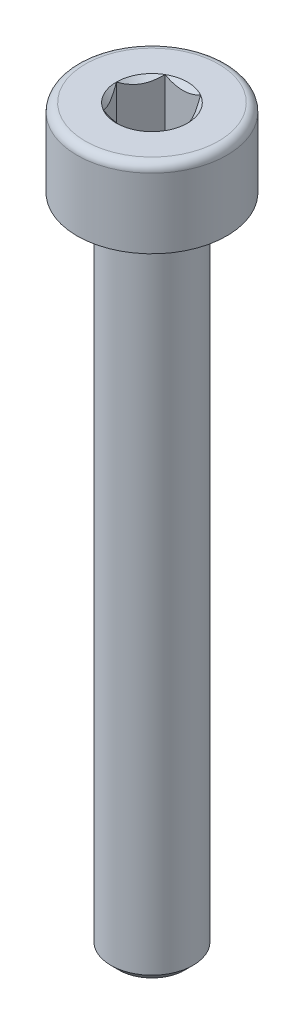
ISO-10303-21;
HEADER;
FILE_DESCRIPTION(('STEP AP214'),'2;1');
FILE_NAME('part.step','',(''),(''),'','','');
FILE_SCHEMA(('AUTOMOTIVE_DESIGN { 1 0 10303 214 1 1 1 1 }'));
ENDSEC;
DATA;
#1=APPLICATION_CONTEXT('core data for automotive mechanical design processes');
#2=APPLICATION_PROTOCOL_DEFINITION('international standard','automotive_design',2000,#1);
#3=PRODUCT_CONTEXT('',#1,'mechanical');
#4=PRODUCT('Part','Part','',(#3));
#5=PRODUCT_RELATED_PRODUCT_CATEGORY('part','',(#4));
#6=PRODUCT_DEFINITION_FORMATION('','',#4);
#7=PRODUCT_DEFINITION_CONTEXT('part definition',#1,'design');
#8=PRODUCT_DEFINITION('design','',#6,#7);
#9=PRODUCT_DEFINITION_SHAPE('','',#8);
#10=(LENGTH_UNIT() NAMED_UNIT(*) SI_UNIT(.MILLI.,.METRE.));
#11=(NAMED_UNIT(*) PLANE_ANGLE_UNIT() SI_UNIT($,.RADIAN.));
#12=(NAMED_UNIT(*) SI_UNIT($,.STERADIAN.) SOLID_ANGLE_UNIT());
#13=UNCERTAINTY_MEASURE_WITH_UNIT(LENGTH_MEASURE(1.E-05),#10,'distance_accuracy_value','');
#14=(GEOMETRIC_REPRESENTATION_CONTEXT(3) GLOBAL_UNCERTAINTY_ASSIGNED_CONTEXT((#13)) GLOBAL_UNIT_ASSIGNED_CONTEXT((#10,
#11,#12)) REPRESENTATION_CONTEXT('',''));
#15=CARTESIAN_POINT('',(0.,0.,0.));
#16=DIRECTION('',(0.,0.,1.));
#17=DIRECTION('',(1.,0.,0.));
#18=AXIS2_PLACEMENT_3D('',#15,#16,#17);
#19=CARTESIAN_POINT('',(0.,1.9,0.));
#20=DIRECTION('',(0.,1.,0.));
#21=DIRECTION('',(0.,0.,1.));
#22=AXIS2_PLACEMENT_3D('',#19,#20,#21);
#23=CONICAL_SURFACE('',#22,0.8675,0.785398163397447);
#24=CARTESIAN_POINT('',(-0.904257203356344,2.20731108686539,0.75));
#25=CARTESIAN_POINT('',(-0.882412754882664,2.19049979910954,0.75));
#26=CARTESIAN_POINT('',(-0.860451107500837,2.17384125033269,0.75));
#27=CARTESIAN_POINT('',(-0.816244486084032,2.14089387022514,0.75));
#28=CARTESIAN_POINT('',(-0.793999446840781,2.12460512647585,0.75));
#29=CARTESIAN_POINT('',(-0.72644041609512,2.07615733343807,0.75));
#30=CARTESIAN_POINT('',(-0.680633506413183,2.04467463278481,0.75));
#31=CARTESIAN_POINT('',(-0.584305204334507,1.98248336485275,0.75));
#32=CARTESIAN_POINT('',(-0.533669074640383,1.95195058649996,0.75));
#33=CARTESIAN_POINT('',(-0.42982179281195,1.89583225025063,0.75));
#34=CARTESIAN_POINT('',(-0.376620129723797,1.87022998377489,0.75));
#35=CARTESIAN_POINT('',(-0.297133733137049,1.83889962113901,0.75));
#36=CARTESIAN_POINT('',(-0.272118020151624,1.82998013178715,0.75));
#37=CARTESIAN_POINT('',(-0.221461613995012,1.81414014673559,0.75));
#38=CARTESIAN_POINT('',(-0.195820881172346,1.80721977822058,0.75));
#39=CARTESIAN_POINT('',(-0.11907719555794,1.79029491353452,0.75));
#40=CARTESIAN_POINT('',(-0.0671369524161806,1.78369713453022,0.75));
#41=CARTESIAN_POINT('',(0.0346954769499289,1.78165186600552,0.75));
#42=CARTESIAN_POINT('',(0.0845776810804192,1.78572847067954,0.75));
#43=CARTESIAN_POINT('',(0.158553806983135,1.79867277619897,0.75));
#44=CARTESIAN_POINT('',(0.183299969448746,1.80421127142444,0.75));
#45=CARTESIAN_POINT('',(0.2322573109883,1.81728731594566,0.75));
#46=CARTESIAN_POINT('',(0.256468520143736,1.82482475252543,0.75));
#47=CARTESIAN_POINT('',(0.330945548164446,1.85089644122846,0.75));
#48=CARTESIAN_POINT('',(0.380191097628158,1.87232740617748,0.75));
#49=CARTESIAN_POINT('',(0.476384677382066,1.92001795957995,0.75));
#50=CARTESIAN_POINT('',(0.523323854348435,1.94629455464135,0.75));
#51=CARTESIAN_POINT('',(0.613051165606589,2.0005514563587,0.75));
#52=CARTESIAN_POINT('',(0.655929862931857,2.02838392150654,0.75));
#53=CARTESIAN_POINT('',(0.719102713352825,2.07143006191857,0.75));
#54=CARTESIAN_POINT('',(0.739888629425195,2.08593448465665,0.75));
#55=CARTESIAN_POINT('',(0.781175323237966,2.11533224663196,0.75));
#56=CARTESIAN_POINT('',(0.801676177588827,2.13022547815469,0.75));
#57=CARTESIAN_POINT('',(0.822058112601666,2.14528009529925,0.75));
#58=B_SPLINE_CURVE_WITH_KNOTS('',3,(#24,#25,#26,#27,#28,#29,#30,#31,#32,#33,#34,#35,#36,#37,#38,
#39,#40,#41,#42,#43,#44,#45,#46,#47,#48,#49,#50,#51,#52,#53,#54,#55,#56,#57),.UNSPECIFIED.,.F.,
.F.,(4,2,2,2,2,2,2,2,2,2,2,2,2,2,2,2,4),(0.,0.0826914229952001,0.165402229814626,
0.332081999269816,0.509334939536265,0.685976204286451,0.765577633128521,0.845184125124187,
1.00113218157557,1.15024704962126,1.22624853107426,1.30224572787936,1.46290132447987,
1.62413188955185,1.7774144062988,1.85345016985303,1.92946508764176),.UNSPECIFIED.);
#59=CARTESIAN_POINT('',(0.433012701892219,1.89852540378444,0.75));
#60=VERTEX_POINT('',#59);
#61=CARTESIAN_POINT('',(-0.433012701892219,1.89852540378444,0.75));
#62=VERTEX_POINT('',#61);
#63=EDGE_CURVE('E116',#60,#62,#58,.F.);
#64=ORIENTED_EDGE('',*,*,#63,.T.);
#65=CARTESIAN_POINT('',(-0.432897231838381,1.89864089692921,0.7502));
#66=CARTESIAN_POINT('',(-0.447787073663449,1.88375951424836,0.724410037442318));
#67=CARTESIAN_POINT('',(-0.462925913388238,1.86975166939139,0.698188797871341));
#68=CARTESIAN_POINT('',(-0.493795969782309,1.8441029284667,0.644720291764294));
#69=CARTESIAN_POINT('',(-0.509530126716838,1.8324763154901,0.617467932539428));
#70=CARTESIAN_POINT('',(-0.541257419404004,1.81255944955668,0.562514649618647));
#71=CARTESIAN_POINT('',(-0.55724246221751,1.80421909786581,0.534827743304491));
#72=CARTESIAN_POINT('',(-0.589564457733289,1.79136814574586,0.478844404869148));
#73=CARTESIAN_POINT('',(-0.605900421776115,1.78684794437327,0.450549685156356));
#74=CARTESIAN_POINT('',(-0.634052006136182,1.78277123688187,0.401789710731158));
#75=CARTESIAN_POINT('',(-0.645830977225007,1.78216820039852,0.381387934344429));
#76=CARTESIAN_POINT('',(-0.66936612345897,1.78317990979996,0.340623865303642));
#77=CARTESIAN_POINT('',(-0.681122293004409,1.78479514477447,0.320261582348547));
#78=CARTESIAN_POINT('',(-0.716222952390205,1.79286155075748,0.259465456913179));
#79=CARTESIAN_POINT('',(-0.739392776123958,1.80253433961216,0.219334145003904));
#80=CARTESIAN_POINT('',(-0.780063953349298,1.82588172175675,0.148889599645977));
#81=CARTESIAN_POINT('',(-0.797755796753171,1.83833396185669,0.118246427990916));
#82=CARTESIAN_POINT('',(-0.832446334428589,1.8663850140153,0.058160654195211));
#83=CARTESIAN_POINT('',(-0.849447072771901,1.88197358968819,0.0287145116184094));
#84=CARTESIAN_POINT('',(-0.866140873838277,1.89864089692921,-0.00020000000000046));
#85=B_SPLINE_CURVE_WITH_KNOTS('',3,(#65,#66,#67,#68,#69,#70,#71,#72,#73,#74,#75,#76,#77,#78,#79,
#80,#81,#82,#83,#84),.UNSPECIFIED.,.F.,.F.,(4,2,2,2,2,2,2,2,2,4),(0.,0.0999419466095594,
0.200466857654445,0.299393763705716,0.398071297300229,0.468665775681746,0.539275821398836,
0.680536257244562,0.792918418368072,0.904939568716033),.UNSPECIFIED.);
#86=CARTESIAN_POINT('',(-0.866025403784439,1.89852540378444,0.));
#87=VERTEX_POINT('',#86);
#88=EDGE_CURVE('E11',#62,#87,#85,.T.);
#89=ORIENTED_EDGE('',*,*,#88,.T.);
#90=CARTESIAN_POINT('',(-0.866140873838277,1.89864089692921,0.000199999999999512));
#91=CARTESIAN_POINT('',(-0.851251032013209,1.88375951424836,-0.0255899625576818));
#92=CARTESIAN_POINT('',(-0.836112192288419,1.8697516693914,-0.0518112021286593));
#93=CARTESIAN_POINT('',(-0.805242135894349,1.8441029284667,-0.105279708235706));
#94=CARTESIAN_POINT('',(-0.78950797895982,1.8324763154901,-0.132532067460572));
#95=CARTESIAN_POINT('',(-0.757780686272654,1.81255944955668,-0.187485350381352));
#96=CARTESIAN_POINT('',(-0.741795643459148,1.80421909786581,-0.215172256695509));
#97=CARTESIAN_POINT('',(-0.709473647943368,1.79136814574586,-0.271155595130852));
#98=CARTESIAN_POINT('',(-0.693137683900543,1.78684794437327,-0.299450314843644));
#99=CARTESIAN_POINT('',(-0.664986099540476,1.78277123688187,-0.348210289268842));
#100=CARTESIAN_POINT('',(-0.653207128451651,1.78216820039852,-0.368612065655571));
#101=CARTESIAN_POINT('',(-0.629671982217688,1.78317990979996,-0.409376134696358));
#102=CARTESIAN_POINT('',(-0.617915812672249,1.78479514477447,-0.429738417651453));
#103=CARTESIAN_POINT('',(-0.582815153286453,1.79286155075748,-0.490534543086821));
#104=CARTESIAN_POINT('',(-0.5596453295527,1.80253433961216,-0.530665854996096));
#105=CARTESIAN_POINT('',(-0.51897415232736,1.82588172175675,-0.601110400354023));
#106=CARTESIAN_POINT('',(-0.501282308923487,1.83833396185669,-0.631753572009084));
#107=CARTESIAN_POINT('',(-0.466591771248069,1.8663850140153,-0.691839345804789));
#108=CARTESIAN_POINT('',(-0.449591032904757,1.88197358968819,-0.72128548838159));
#109=CARTESIAN_POINT('',(-0.432897231838381,1.89864089692921,-0.7502));
#110=B_SPLINE_CURVE_WITH_KNOTS('',3,(#90,#91,#92,#93,#94,#95,#96,#97,#98,#99,#100,#101,#102,
#103,#104,#105,#106,#107,#108,#109),.UNSPECIFIED.,.F.,.F.,(4,2,2,2,2,2,2,2,2,4),(0.,
0.0999419466095592,0.200466857654445,0.299393763705716,0.398071297300228,0.468665775681745,
0.539275821398836,0.680536257244562,0.792918418368072,0.904939568716032),.UNSPECIFIED.);
#111=CARTESIAN_POINT('',(-0.433012701892219,1.89852540378444,-0.75));
#112=VERTEX_POINT('',#111);
#113=EDGE_CURVE('E51',#87,#112,#110,.T.);
#114=ORIENTED_EDGE('',*,*,#113,.T.);
#115=CARTESIAN_POINT('',(-0.904257203356344,2.20731108686539,-0.75));
#116=CARTESIAN_POINT('',(-0.882412754882664,2.19049979910954,-0.75));
#117=CARTESIAN_POINT('',(-0.860451107500837,2.17384125033269,-0.75));
#118=CARTESIAN_POINT('',(-0.816244486084032,2.14089387022514,-0.75));
#119=CARTESIAN_POINT('',(-0.793999446840781,2.12460512647585,-0.75));
#120=CARTESIAN_POINT('',(-0.72644041609512,2.07615733343807,-0.75));
#121=CARTESIAN_POINT('',(-0.680633506413183,2.04467463278481,-0.75));
#122=CARTESIAN_POINT('',(-0.584305204334507,1.98248336485275,-0.75));
#123=CARTESIAN_POINT('',(-0.533669074640383,1.95195058649996,-0.75));
#124=CARTESIAN_POINT('',(-0.42982179281195,1.89583225025063,-0.75));
#125=CARTESIAN_POINT('',(-0.376620129723797,1.87022998377489,-0.75));
#126=CARTESIAN_POINT('',(-0.297133733137048,1.83889962113901,-0.75));
#127=CARTESIAN_POINT('',(-0.272118020151624,1.82998013178715,-0.75));
#128=CARTESIAN_POINT('',(-0.221461613995012,1.81414014673559,-0.75));
#129=CARTESIAN_POINT('',(-0.195820881172346,1.80721977822059,-0.75));
#130=CARTESIAN_POINT('',(-0.11907719555794,1.79029491353453,-0.75));
#131=CARTESIAN_POINT('',(-0.0671369524161802,1.78369713453023,-0.75));
#132=CARTESIAN_POINT('',(0.0346954769499295,1.78165186600552,-0.75));
#133=CARTESIAN_POINT('',(0.0845776810804198,1.78572847067954,-0.75));
#134=CARTESIAN_POINT('',(0.158553806983135,1.79867277619897,-0.75));
#135=CARTESIAN_POINT('',(0.183299969448746,1.80421127142444,-0.75));
#136=CARTESIAN_POINT('',(0.2322573109883,1.81728731594566,-0.75));
#137=CARTESIAN_POINT('',(0.256468520143736,1.82482475252543,-0.75));
#138=CARTESIAN_POINT('',(0.330945548164446,1.85089644122846,-0.75));
#139=CARTESIAN_POINT('',(0.380191097628158,1.87232740617748,-0.75));
#140=CARTESIAN_POINT('',(0.476384677382067,1.92001795957995,-0.75));
#141=CARTESIAN_POINT('',(0.523323854348436,1.94629455464135,-0.75));
#142=CARTESIAN_POINT('',(0.61305116560659,2.0005514563587,-0.75));
#143=CARTESIAN_POINT('',(0.655929862931858,2.02838392150654,-0.75));
#144=CARTESIAN_POINT('',(0.719102713352826,2.07143006191857,-0.75));
#145=CARTESIAN_POINT('',(0.739888629425196,2.08593448465665,-0.75));
#146=CARTESIAN_POINT('',(0.781175323237966,2.11533224663196,-0.75));
#147=CARTESIAN_POINT('',(0.801676177588828,2.13022547815469,-0.75));
#148=CARTESIAN_POINT('',(0.822058112601667,2.14528009529925,-0.75));
#149=B_SPLINE_CURVE_WITH_KNOTS('',3,(#115,#116,#117,#118,#119,#120,#121,#122,#123,#124,#125,
#126,#127,#128,#129,#130,#131,#132,#133,#134,#135,#136,#137,#138,#139,#140,#141,#142,#143,#144,
#145,#146,#147,#148),.UNSPECIFIED.,.F.,.F.,(4,2,2,2,2,2,2,2,2,2,2,2,2,2,2,2,4),(0.,
0.0826914229952003,0.165402229814626,0.332081999269817,0.509334939536265,0.685976204286452,
0.765577633128521,0.845184125124188,1.00113218157557,1.15024704962126,1.22624853107426,
1.30224572787936,1.46290132447987,1.62413188955185,1.7774144062988,1.85345016985303,
1.92946508764176),.UNSPECIFIED.);
#150=CARTESIAN_POINT('',(0.433012701892219,1.89852540378444,-0.75));
#151=VERTEX_POINT('',#150);
#152=EDGE_CURVE('E254',#112,#151,#149,.T.);
#153=ORIENTED_EDGE('',*,*,#152,.T.);
#154=CARTESIAN_POINT('',(0.432897231838381,1.89864089692921,-0.7502));
#155=CARTESIAN_POINT('',(0.447787073663449,1.88375951424836,-0.724410037442319));
#156=CARTESIAN_POINT('',(0.462925913388238,1.8697516693914,-0.698188797871341));
#157=CARTESIAN_POINT('',(0.493795969782309,1.8441029284667,-0.644720291764295));
#158=CARTESIAN_POINT('',(0.509530126716838,1.8324763154901,-0.617467932539429));
#159=CARTESIAN_POINT('',(0.541257419404004,1.81255944955668,-0.562514649618648));
#160=CARTESIAN_POINT('',(0.55724246221751,1.80421909786581,-0.534827743304492));
#161=CARTESIAN_POINT('',(0.589564457733289,1.79136814574586,-0.478844404869149));
#162=CARTESIAN_POINT('',(0.605900421776115,1.78684794437327,-0.450549685156357));
#163=CARTESIAN_POINT('',(0.634052006136182,1.78277123688187,-0.401789710731159));
#164=CARTESIAN_POINT('',(0.645830977225007,1.78216820039852,-0.38138793434443));
#165=CARTESIAN_POINT('',(0.66936612345897,1.78317990979996,-0.340623865303643));
#166=CARTESIAN_POINT('',(0.681122293004409,1.78479514477447,-0.320261582348548));
#167=CARTESIAN_POINT('',(0.716222952390205,1.79286155075748,-0.25946545691318));
#168=CARTESIAN_POINT('',(0.739392776123958,1.80253433961216,-0.219334145003905));
#169=CARTESIAN_POINT('',(0.780063953349298,1.82588172175675,-0.148889599645978));
#170=CARTESIAN_POINT('',(0.797755796753172,1.83833396185669,-0.118246427990917));
#171=CARTESIAN_POINT('',(0.832446334428589,1.8663850140153,-0.058160654195212));
#172=CARTESIAN_POINT('',(0.849447072771901,1.88197358968819,-0.0287145116184103));
#173=CARTESIAN_POINT('',(0.866140873838277,1.89864089692921,0.000199999999999458));
#174=B_SPLINE_CURVE_WITH_KNOTS('',3,(#154,#155,#156,#157,#158,#159,#160,#161,#162,#163,#164,
#165,#166,#167,#168,#169,#170,#171,#172,#173),.UNSPECIFIED.,.F.,.F.,(4,2,2,2,2,2,2,2,2,4),(0.,
0.0999419466095591,0.200466857654445,0.299393763705716,0.398071297300228,0.468665775681745,
0.539275821398836,0.680536257244562,0.792918418368072,0.904939568716032),.UNSPECIFIED.);
#175=CARTESIAN_POINT('',(0.866025403784439,1.89852540378444,0.));
#176=VERTEX_POINT('',#175);
#177=EDGE_CURVE('E248',#151,#176,#174,.T.);
#178=ORIENTED_EDGE('',*,*,#177,.T.);
#179=CARTESIAN_POINT('',(0.866140873838277,1.89864089692921,-0.000200000000000392));
#180=CARTESIAN_POINT('',(0.851251032013209,1.88375951424836,0.025589962557681));
#181=CARTESIAN_POINT('',(0.836112192288419,1.86975166939139,0.0518112021286586));
#182=CARTESIAN_POINT('',(0.805242135894349,1.8441029284667,0.105279708235706));
#183=CARTESIAN_POINT('',(0.78950797895982,1.8324763154901,0.132532067460572));
#184=CARTESIAN_POINT('',(0.757780686272654,1.81255944955668,0.187485350381352));
#185=CARTESIAN_POINT('',(0.741795643459148,1.80421909786581,0.215172256695508));
#186=CARTESIAN_POINT('',(0.709473647943368,1.79136814574586,0.271155595130852));
#187=CARTESIAN_POINT('',(0.693137683900543,1.78684794437327,0.299450314843643));
#188=CARTESIAN_POINT('',(0.664986099540475,1.78277123688187,0.348210289268842));
#189=CARTESIAN_POINT('',(0.653207128451651,1.78216820039852,0.368612065655571));
#190=CARTESIAN_POINT('',(0.629671982217688,1.78317990979996,0.409376134696358));
#191=CARTESIAN_POINT('',(0.617915812672248,1.78479514477447,0.429738417651453));
#192=CARTESIAN_POINT('',(0.582815153286452,1.79286155075748,0.490534543086821));
#193=CARTESIAN_POINT('',(0.5596453295527,1.80253433961216,0.530665854996096));
#194=CARTESIAN_POINT('',(0.51897415232736,1.82588172175675,0.601110400354023));
#195=CARTESIAN_POINT('',(0.501282308923486,1.83833396185669,0.631753572009084));
#196=CARTESIAN_POINT('',(0.466591771248069,1.8663850140153,0.691839345804788));
#197=CARTESIAN_POINT('',(0.449591032904757,1.88197358968819,0.72128548838159));
#198=CARTESIAN_POINT('',(0.432897231838381,1.89864089692921,0.7502));
#199=B_SPLINE_CURVE_WITH_KNOTS('',3,(#179,#180,#181,#182,#183,#184,#185,#186,#187,#188,#189,
#190,#191,#192,#193,#194,#195,#196,#197,#198),.UNSPECIFIED.,.F.,.F.,(4,2,2,2,2,2,2,2,2,4),(0.,
0.0999419466095594,0.200466857654446,0.299393763705716,0.398071297300229,0.468665775681746,
0.539275821398837,0.680536257244563,0.792918418368072,0.904939568716032),.UNSPECIFIED.);
#200=EDGE_CURVE('E230',#176,#60,#199,.T.);
#201=ORIENTED_EDGE('',*,*,#200,.T.);
#202=EDGE_LOOP('',(#64,#89,#114,#153,#178,#201));
#203=FACE_BOUND('',#202,.T.);
#204=CARTESIAN_POINT('',(0.,1.9,0.));
#205=DIRECTION('',(0.,1.,0.));
#206=DIRECTION('',(0.,0.,1.));
#207=AXIS2_PLACEMENT_3D('',#204,#205,#206);
#208=CIRCLE('',#207,0.8675);
#209=CARTESIAN_POINT('',(0.,1.9,0.8675));
#210=VERTEX_POINT('',#209);
#211=EDGE_CURVE('E221',#210,#210,#208,.T.);
#212=ORIENTED_EDGE('',*,*,#211,.T.);
#213=EDGE_LOOP('',(#212));
#214=FACE_BOUND('',#213,.T.);
#215=ADVANCED_FACE('F38',(#203,#214),#23,.F.);
#216=CARTESIAN_POINT('',(0.,1.9,-1.625));
#217=DIRECTION('',(0.,-1.,0.));
#218=DIRECTION('',(0.,0.,-1.));
#219=AXIS2_PLACEMENT_3D('',#216,#217,#218);
#220=PLANE('',#219);
#221=ORIENTED_EDGE('',*,*,#211,.F.);
#222=EDGE_LOOP('',(#221));
#223=FACE_BOUND('',#222,.T.);
#224=CARTESIAN_POINT('',(0.,1.9,0.));
#225=DIRECTION('',(0.,1.,0.));
#226=DIRECTION('',(0.,0.,1.));
#227=AXIS2_PLACEMENT_3D('',#224,#225,#226);
#228=CIRCLE('',#227,1.625);
#229=CARTESIAN_POINT('',(0.,1.9,1.625));
#230=VERTEX_POINT('',#229);
#231=EDGE_CURVE('E217',#230,#230,#228,.T.);
#232=ORIENTED_EDGE('',*,*,#231,.T.);
#233=EDGE_LOOP('',(#232));
#234=FACE_BOUND('',#233,.T.);
#235=ADVANCED_FACE('F240',(#223,#234),#220,.F.);
#236=CARTESIAN_POINT('',(0.,1.7,0.));
#237=DIRECTION('',(0.,1.,0.));
#238=DIRECTION('',(0.,0.,1.));
#239=AXIS2_PLACEMENT_3D('',#236,#237,#238);
#240=TOROIDAL_SURFACE('',#239,1.625,0.2);
#241=ORIENTED_EDGE('',*,*,#231,.F.);
#242=EDGE_LOOP('',(#241));
#243=FACE_BOUND('',#242,.T.);
#244=CARTESIAN_POINT('',(0.,1.7,0.));
#245=DIRECTION('',(0.,1.,0.));
#246=DIRECTION('',(0.,0.,1.));
#247=AXIS2_PLACEMENT_3D('',#244,#245,#246);
#248=CIRCLE('',#247,1.825);
#249=CARTESIAN_POINT('',(0.,1.7,1.825));
#250=VERTEX_POINT('',#249);
#251=EDGE_CURVE('E213',#250,#250,#248,.T.);
#252=ORIENTED_EDGE('',*,*,#251,.T.);
#253=EDGE_LOOP('',(#252));
#254=FACE_BOUND('',#253,.T.);
#255=ADVANCED_FACE('F319',(#243,#254),#240,.T.);
#256=CARTESIAN_POINT('',(0.,2.83766527063465,0.));
#257=DIRECTION('',(0.,1.,0.));
#258=DIRECTION('',(0.,0.,1.));
#259=AXIS2_PLACEMENT_3D('',#256,#257,#258);
#260=CYLINDRICAL_SURFACE('',#259,1.825);
#261=ORIENTED_EDGE('',*,*,#251,.F.);
#262=EDGE_LOOP('',(#261));
#263=FACE_BOUND('',#262,.T.);
#264=CARTESIAN_POINT('',(0.,0.,0.));
#265=DIRECTION('',(0.,1.,0.));
#266=DIRECTION('',(0.,0.,1.));
#267=AXIS2_PLACEMENT_3D('',#264,#265,#266);
#268=CIRCLE('',#267,1.825);
#269=CARTESIAN_POINT('',(0.,0.,1.825));
#270=VERTEX_POINT('',#269);
#271=EDGE_CURVE('E209',#270,#270,#268,.T.);
#272=ORIENTED_EDGE('',*,*,#271,.T.);
#273=EDGE_LOOP('',(#272));
#274=FACE_BOUND('',#273,.T.);
#275=ADVANCED_FACE('F316',(#263,#274),#260,.T.);
#276=CARTESIAN_POINT('',(0.,0.,-1.2));
#277=DIRECTION('',(0.,1.,0.));
#278=DIRECTION('',(0.,0.,1.));
#279=AXIS2_PLACEMENT_3D('',#276,#277,#278);
#280=PLANE('',#279);
#281=ORIENTED_EDGE('',*,*,#271,.F.);
#282=EDGE_LOOP('',(#281));
#283=FACE_BOUND('',#282,.T.);
#284=CARTESIAN_POINT('',(0.,0.,0.));
#285=DIRECTION('',(0.,1.,0.));
#286=DIRECTION('',(0.,0.,1.));
#287=AXIS2_PLACEMENT_3D('',#284,#285,#286);
#288=CIRCLE('',#287,1.2);
#289=CARTESIAN_POINT('',(0.,0.,1.2));
#290=VERTEX_POINT('',#289);
#291=EDGE_CURVE('E205',#290,#290,#288,.T.);
#292=ORIENTED_EDGE('',*,*,#291,.T.);
#293=EDGE_LOOP('',(#292));
#294=FACE_BOUND('',#293,.T.);
#295=ADVANCED_FACE('F312',(#283,#294),#280,.F.);
#296=CARTESIAN_POINT('',(0.,-0.2,0.));
#297=DIRECTION('',(0.,1.,0.));
#298=DIRECTION('',(0.,0.,1.));
#299=AXIS2_PLACEMENT_3D('',#296,#297,#298);
#300=TOROIDAL_SURFACE('',#299,1.2,0.2);
#301=ORIENTED_EDGE('',*,*,#291,.F.);
#302=EDGE_LOOP('',(#301));
#303=FACE_BOUND('',#302,.T.);
#304=CARTESIAN_POINT('',(0.,-0.2,0.));
#305=DIRECTION('',(0.,1.,0.));
#306=DIRECTION('',(0.,0.,1.));
#307=AXIS2_PLACEMENT_3D('',#304,#305,#306);
#308=CIRCLE('',#307,1.);
#309=CARTESIAN_POINT('',(0.,-0.2,1.));
#310=VERTEX_POINT('',#309);
#311=EDGE_CURVE('E201',#310,#310,#308,.T.);
#312=ORIENTED_EDGE('',*,*,#311,.T.);
#313=EDGE_LOOP('',(#312));
#314=FACE_BOUND('',#313,.T.);
#315=ADVANCED_FACE('F308',(#303,#314),#300,.F.);
#316=CARTESIAN_POINT('',(0.,2.83766527063465,0.));
#317=DIRECTION('',(0.,1.,0.));
#318=DIRECTION('',(0.,0.,1.));
#319=AXIS2_PLACEMENT_3D('',#316,#317,#318);
#320=CYLINDRICAL_SURFACE('',#319,1.);
#321=ORIENTED_EDGE('',*,*,#311,.F.);
#322=EDGE_LOOP('',(#321));
#323=FACE_BOUND('',#322,.T.);
#324=CARTESIAN_POINT('',(0.,-15.8,0.));
#325=DIRECTION('',(0.,1.,0.));
#326=DIRECTION('',(0.,0.,1.));
#327=AXIS2_PLACEMENT_3D('',#324,#325,#326);
#328=CIRCLE('',#327,1.);
#329=CARTESIAN_POINT('',(0.,-15.8,1.));
#330=VERTEX_POINT('',#329);
#331=EDGE_CURVE('E198',#330,#330,#328,.T.);
#332=ORIENTED_EDGE('',*,*,#331,.T.);
#333=EDGE_LOOP('',(#332));
#334=FACE_BOUND('',#333,.T.);
#335=ADVANCED_FACE('F304',(#323,#334),#320,.T.);
#336=CARTESIAN_POINT('',(0.,-16.,0.));
#337=DIRECTION('',(0.,1.,0.));
#338=DIRECTION('',(0.,0.,1.));
#339=AXIS2_PLACEMENT_3D('',#336,#337,#338);
#340=CONICAL_SURFACE('',#339,0.800000000000002,0.785398163397434);
#341=ORIENTED_EDGE('',*,*,#331,.F.);
#342=EDGE_LOOP('',(#341));
#343=FACE_BOUND('',#342,.T.);
#344=CARTESIAN_POINT('',(0.,-16.,0.));
#345=DIRECTION('',(0.,1.,0.));
#346=DIRECTION('',(0.,0.,1.));
#347=AXIS2_PLACEMENT_3D('',#344,#345,#346);
#348=CIRCLE('',#347,0.800000000000002);
#349=CARTESIAN_POINT('',(0.,-16.,0.800000000000002));
#350=VERTEX_POINT('',#349);
#351=EDGE_CURVE('E195',#350,#350,#348,.T.);
#352=ORIENTED_EDGE('',*,*,#351,.T.);
#353=EDGE_LOOP('',(#352));
#354=FACE_BOUND('',#353,.T.);
#355=ADVANCED_FACE('F297',(#343,#354),#340,.T.);
#356=CARTESIAN_POINT('',(0.,-16.,0.));
#357=DIRECTION('',(0.,1.,0.));
#358=DIRECTION('',(0.,0.,1.));
#359=AXIS2_PLACEMENT_3D('',#356,#357,#358);
#360=PLANE('',#359);
#361=ORIENTED_EDGE('',*,*,#351,.F.);
#362=EDGE_LOOP('',(#361));
#363=FACE_BOUND('',#362,.T.);
#364=ADVANCED_FACE('F293',(#363),#360,.F.);
#365=CARTESIAN_POINT('',(-0.649519052838329,0.8,0.375));
#366=DIRECTION('',(-0.866025403784438,0.,0.5));
#367=DIRECTION('',(0.5,0.,0.866025403784439));
#368=AXIS2_PLACEMENT_3D('',#365,#366,#367);
#369=PLANE('',#368);
#370=ORIENTED_EDGE('',*,*,#88,.F.);
#371=DIRECTION('',(0.,1.,0.));
#372=VECTOR('',#371,1.);
#373=CARTESIAN_POINT('',(-0.433012701892219,0.8,0.75));
#374=LINE('',#373,#372);
#375=CARTESIAN_POINT('',(-0.433012701891886,0.699148641473365,0.750000000000577));
#376=VERTEX_POINT('',#375);
#377=EDGE_CURVE('E60',#376,#62,#374,.T.);
#378=ORIENTED_EDGE('',*,*,#377,.F.);
#379=CARTESIAN_POINT('',(-0.866140873838277,0.699215321476222,-0.000200000000000537));
#380=CARTESIAN_POINT('',(-0.847110639113084,0.688220674223405,0.0327613334239951));
#381=CARTESIAN_POINT('',(-0.82791613989027,0.678220782647563,0.0660071813037495));
#382=CARTESIAN_POINT('',(-0.789194642655935,0.660764353404076,0.133074781858755));
#383=CARTESIAN_POINT('',(-0.769666955685214,0.653313993806985,0.166897727846345));
#384=CARTESIAN_POINT('',(-0.730853637225087,0.641714345217258,0.234124367429636));
#385=CARTESIAN_POINT('',(-0.71157398392345,0.637487889682862,0.267517706500385));
#386=CARTESIAN_POINT('',(-0.672923778458478,0.632438787424669,0.334461826088693));
#387=CARTESIAN_POINT('',(-0.653553367146577,0.631611963412167,0.368012362644412));
#388=CARTESIAN_POINT('',(-0.617346612643384,0.633315409517752,0.430724301021116));
#389=CARTESIAN_POINT('',(-0.600504899317171,0.635427420851539,0.459895004188625));
#390=CARTESIAN_POINT('',(-0.566931216773448,0.642126429282162,0.518046328151542));
#391=CARTESIAN_POINT('',(-0.550199364021242,0.646715723431468,0.547026747223125));
#392=CARTESIAN_POINT('',(-0.516556238850178,0.658190638358433,0.605298349344807));
#393=CARTESIAN_POINT('',(-0.499649233036119,0.665124989147788,0.634582142418619));
#394=CARTESIAN_POINT('',(-0.466087649424642,0.680864019072363,0.692712510416168));
#395=CARTESIAN_POINT('',(-0.449432640341858,0.689664990664254,0.721559832348071));
#396=CARTESIAN_POINT('',(-0.432897231838381,0.699215321476221,0.7502));
#397=B_SPLINE_CURVE_WITH_KNOTS('',3,(#379,#380,#381,#382,#383,#384,#385,#386,#387,#388,#389,
#390,#391,#392,#393,#394,#395,#396),.UNSPECIFIED.,.F.,.F.,(4,2,2,2,2,2,2,2,4),(0.,
0.118896819359341,0.238079744533805,0.354311719456401,0.470400831872515,0.571553114284105,
0.672799351342655,0.776293900714049,0.87958477934405),.UNSPECIFIED.);
#398=CARTESIAN_POINT('',(-0.866025403784772,0.699148641473366,5.76386946737661E-13));
#399=VERTEX_POINT('',#398);
#400=EDGE_CURVE('E128',#399,#376,#397,.T.);
#401=ORIENTED_EDGE('',*,*,#400,.F.);
#402=DIRECTION('',(0.,1.,0.));
#403=VECTOR('',#402,1.);
#404=CARTESIAN_POINT('',(-0.866025403784439,0.8,0.));
#405=LINE('',#404,#403);
#406=EDGE_CURVE('E71',#399,#87,#405,.T.);
#407=ORIENTED_EDGE('',*,*,#406,.T.);
#408=EDGE_LOOP('',(#370,#378,#401,#407));
#409=FACE_BOUND('',#408,.T.);
#410=ADVANCED_FACE('F270',(#409),#369,.F.);
#411=CARTESIAN_POINT('',(-0.649519052838329,0.8,-0.375));
#412=DIRECTION('',(-0.866025403784438,0.,-0.5));
#413=DIRECTION('',(-0.5,0.,0.866025403784439));
#414=AXIS2_PLACEMENT_3D('',#411,#412,#413);
#415=PLANE('',#414);
#416=ORIENTED_EDGE('',*,*,#113,.F.);
#417=ORIENTED_EDGE('',*,*,#406,.F.);
#418=CARTESIAN_POINT('',(-0.432897231838381,0.699215321476222,-0.7502));
#419=CARTESIAN_POINT('',(-0.451927466563574,0.688220674223406,-0.717238666576005));
#420=CARTESIAN_POINT('',(-0.471121965786388,0.678220782647563,-0.68399281869625));
#421=CARTESIAN_POINT('',(-0.509843463020723,0.660764353404076,-0.616925218141245));
#422=CARTESIAN_POINT('',(-0.529371149991444,0.653313993806985,-0.583102272153655));
#423=CARTESIAN_POINT('',(-0.568184468451571,0.641714345217258,-0.515875632570364));
#424=CARTESIAN_POINT('',(-0.587464121753208,0.637487889682863,-0.482482293499614));
#425=CARTESIAN_POINT('',(-0.62611432721818,0.63243878742467,-0.415538173911307));
#426=CARTESIAN_POINT('',(-0.645484738530081,0.631611963412168,-0.381987637355588));
#427=CARTESIAN_POINT('',(-0.681691493033274,0.633315409517752,-0.319275698978884));
#428=CARTESIAN_POINT('',(-0.698533206359487,0.63542742085154,-0.290104995811375));
#429=CARTESIAN_POINT('',(-0.732106888903209,0.642126429282163,-0.231953671848458));
#430=CARTESIAN_POINT('',(-0.748838741655416,0.646715723431468,-0.202973252776875));
#431=CARTESIAN_POINT('',(-0.78248186682648,0.658190638358434,-0.144701650655193));
#432=CARTESIAN_POINT('',(-0.799388872640539,0.665124989147789,-0.115417857581381));
#433=CARTESIAN_POINT('',(-0.832950456252016,0.680864019072363,-0.0572874895838321));
#434=CARTESIAN_POINT('',(-0.8496054653348,0.689664990664254,-0.028440167651929));
#435=CARTESIAN_POINT('',(-0.866140873838277,0.699215321476222,0.00019999999999951));
#436=B_SPLINE_CURVE_WITH_KNOTS('',3,(#418,#419,#420,#421,#422,#423,#424,#425,#426,#427,#428,
#429,#430,#431,#432,#433,#434,#435),.UNSPECIFIED.,.F.,.F.,(4,2,2,2,2,2,2,2,4),(0.,
0.118896819359341,0.238079744533805,0.354311719456401,0.470400831872515,0.571553114284105,
0.672799351342655,0.776293900714049,0.87958477934405),.UNSPECIFIED.);
#437=CARTESIAN_POINT('',(-0.43301270189222,0.699148641477997,-0.75));
#438=VERTEX_POINT('',#437);
#439=EDGE_CURVE('E171',#438,#399,#436,.T.);
#440=ORIENTED_EDGE('',*,*,#439,.F.);
#441=DIRECTION('',(0.,1.,0.));
#442=VECTOR('',#441,1.);
#443=CARTESIAN_POINT('',(-0.433012701892219,0.8,-0.75));
#444=LINE('',#443,#442);
#445=EDGE_CURVE('E271',#438,#112,#444,.T.);
#446=ORIENTED_EDGE('',*,*,#445,.T.);
#447=EDGE_LOOP('',(#416,#417,#440,#446));
#448=FACE_BOUND('',#447,.T.);
#449=ADVANCED_FACE('F155',(#448),#415,.F.);
#450=CARTESIAN_POINT('',(0.,0.8,-0.75));
#451=DIRECTION('',(0.,0.,-1.));
#452=DIRECTION('',(-1.,0.,0.));
#453=AXIS2_PLACEMENT_3D('',#450,#451,#452);
#454=PLANE('',#453);
#455=ORIENTED_EDGE('',*,*,#152,.F.);
#456=ORIENTED_EDGE('',*,*,#445,.F.);
#457=CARTESIAN_POINT('',(-1.14392924171127,0.988889972556753,-0.750000000000001));
#458=CARTESIAN_POINT('',(-1.11129928011968,0.973138090869845,-0.750000000000001));
#459=CARTESIAN_POINT('',(-1.07859265503181,0.957545743427019,-0.750000000000001));
#460=CARTESIAN_POINT('',(-1.012984149522,0.926763375327337,-0.750000000000001));
#461=CARTESIAN_POINT('',(-0.980082237318409,0.911573422484459,-0.750000000000001));
#462=CARTESIAN_POINT('',(-0.88066267507201,0.866570463757842,-0.750000000000001));
#463=CARTESIAN_POINT('',(-0.81380045948897,0.837505001643094,-0.75));
#464=CARTESIAN_POINT('',(-0.676891071509725,0.781742542375791,-0.75));
#465=CARTESIAN_POINT('',(-0.606807141507163,0.755134658188647,-0.75));
#466=CARTESIAN_POINT('',(-0.46484559913824,0.707499590873555,-0.75));
#467=CARTESIAN_POINT('',(-0.392972860708597,0.686458745099361,-0.75));
#468=CARTESIAN_POINT('',(-0.283762301486207,0.661719184110614,-0.75));
#469=CARTESIAN_POINT('',(-0.247205008136231,0.654617583350701,-0.75));
#470=CARTESIAN_POINT('',(-0.173656205225225,0.643146979032118,-0.75));
#471=CARTESIAN_POINT('',(-0.136664738331818,0.638777709211616,-0.75));
#472=CARTESIAN_POINT('',(-0.0629045494364837,0.633176185039324,-0.75));
#473=CARTESIAN_POINT('',(-0.02613884151586,0.631905321123122,-0.75));
#474=CARTESIAN_POINT('',(0.0473669674614357,0.632504085636384,-0.75));
#475=CARTESIAN_POINT('',(0.0841070664259308,0.634373946058491,-0.75));
#476=CARTESIAN_POINT('',(0.173345015364301,0.642565343932932,-0.75));
#477=CARTESIAN_POINT('',(0.225697450576709,0.650477813191898,-0.75));
#478=CARTESIAN_POINT('',(0.329421021547351,0.671247227700126,-0.75));
#479=CARTESIAN_POINT('',(0.380790948181767,0.684109899551848,-0.75));
#480=CARTESIAN_POINT('',(0.483729694328043,0.713753062882601,-0.75));
#481=CARTESIAN_POINT('',(0.535272413043993,0.730622016756376,-0.75));
#482=CARTESIAN_POINT('',(0.611869547821967,0.757862349549278,-0.75));
#483=CARTESIAN_POINT('',(0.637278832990042,0.767263786282497,-0.75));
#484=CARTESIAN_POINT('',(0.687893903774538,0.786611675487553,-0.75));
#485=CARTESIAN_POINT('',(0.713099658867192,0.796558208028436,-0.75));
#486=CARTESIAN_POINT('',(0.797346245898725,0.83067471888575,-0.75));
#487=CARTESIAN_POINT('',(0.855974220880225,0.855862404697281,-0.75));
#488=CARTESIAN_POINT('',(0.972500365064712,0.907879776895605,-0.75));
#489=CARTESIAN_POINT('',(1.03039838428627,0.934709794303458,-0.75));
#490=CARTESIAN_POINT('',(1.14568483442828,0.9895121454834,-0.75));
#491=CARTESIAN_POINT('',(1.20307299547003,1.01748504490513,-0.75));
#492=CARTESIAN_POINT('',(1.31745118876516,1.07423502082449,-0.75));
#493=CARTESIAN_POINT('',(1.37444120581081,1.10301212783243,-0.75));
#494=CARTESIAN_POINT('',(1.54520955042651,1.19033369355946,-0.75));
#495=CARTESIAN_POINT('',(1.65854144440532,1.24974947544961,-0.75));
#496=CARTESIAN_POINT('',(1.88446377235471,1.3698751839927,-0.75));
#497=CARTESIAN_POINT('',(1.99705443810476,1.43058467822829,-0.75));
#498=CARTESIAN_POINT('',(2.20562560728674,1.54404647664553,-0.75));
#499=CARTESIAN_POINT('',(2.30166658321441,1.59668772574537,-0.75));
#500=CARTESIAN_POINT('',(2.49352154930147,1.70240423146011,-0.75));
#501=CARTESIAN_POINT('',(2.58933551579986,1.75547953095283,-0.75));
#502=CARTESIAN_POINT('',(2.78041816930175,1.86173344145093,-0.75));
#503=CARTESIAN_POINT('',(2.87568752730211,1.91491084672778,-0.75));
#504=CARTESIAN_POINT('',(3.06608386909457,2.02149550384075,-0.75));
#505=CARTESIAN_POINT('',(3.16121086738527,2.0749027297698,-0.75));
#506=CARTESIAN_POINT('',(3.25629167728812,2.12839162665602,-0.75));
#507=B_SPLINE_CURVE_WITH_KNOTS('',3,(#457,#458,#459,#460,#461,#462,#463,#464,#465,#466,#467,
#468,#469,#470,#471,#472,#473,#474,#475,#476,#477,#478,#479,#480,#481,#482,#483,#484,#485,#486,
#487,#488,#489,#490,#491,#492,#493,#494,#495,#496,#497,#498,#499,#500,#501,#502,#503,#504,#505,
#506),.UNSPECIFIED.,.F.,.F.,(4,2,2,2,2,2,2,2,2,2,2,2,2,2,2,2,2,2,2,2,2,2,2,2,4),(0.,
0.108697578912757,0.217413361143597,0.4360778158952,0.660865347278843,0.885095976681721,
0.996734001704509,1.10836114606183,1.21859001746764,1.32882703139378,1.48734075732974,
1.64603841251773,1.80863365439765,1.88990790289077,1.97119412191388,2.16257832306687,
2.35400122660177,2.54552004734117,2.7370461438776,3.12091442439534,3.50465635106728,
3.83321936376042,4.16181523545699,4.48913241989211,4.81641362588254),.UNSPECIFIED.);
#508=CARTESIAN_POINT('',(0.433012701891886,0.699148641473366,-0.750000000000577));
#509=VERTEX_POINT('',#508);
#510=EDGE_CURVE('E135',#509,#438,#507,.F.);
#511=ORIENTED_EDGE('',*,*,#510,.F.);
#512=DIRECTION('',(0.,1.,0.));
#513=VECTOR('',#512,1.);
#514=CARTESIAN_POINT('',(0.433012701892219,0.8,-0.75));
#515=LINE('',#514,#513);
#516=EDGE_CURVE('E273',#509,#151,#515,.T.);
#517=ORIENTED_EDGE('',*,*,#516,.T.);
#518=EDGE_LOOP('',(#455,#456,#511,#517));
#519=FACE_BOUND('',#518,.T.);
#520=ADVANCED_FACE('F274',(#519),#454,.F.);
#521=CARTESIAN_POINT('',(0.649519052838329,0.8,-0.375));
#522=DIRECTION('',(0.866025403784438,0.,-0.5));
#523=DIRECTION('',(-0.5,0.,-0.866025403784438));
#524=AXIS2_PLACEMENT_3D('',#521,#522,#523);
#525=PLANE('',#524);
#526=ORIENTED_EDGE('',*,*,#177,.F.);
#527=ORIENTED_EDGE('',*,*,#516,.F.);
#528=CARTESIAN_POINT('',(0.866140873838277,0.699215321476222,0.000199999999999607));
#529=CARTESIAN_POINT('',(0.847110639113084,0.688220674223406,-0.032761333423996));
#530=CARTESIAN_POINT('',(0.82791613989027,0.678220782647563,-0.0660071813037505));
#531=CARTESIAN_POINT('',(0.789194642655935,0.660764353404076,-0.133074781858756));
#532=CARTESIAN_POINT('',(0.769666955685214,0.653313993806985,-0.166897727846346));
#533=CARTESIAN_POINT('',(0.730853637225087,0.641714345217258,-0.234124367429637));
#534=CARTESIAN_POINT('',(0.71157398392345,0.637487889682862,-0.267517706500386));
#535=CARTESIAN_POINT('',(0.672923778458477,0.632438787424669,-0.334461826088694));
#536=CARTESIAN_POINT('',(0.653553367146577,0.631611963412168,-0.368012362644413));
#537=CARTESIAN_POINT('',(0.617346612643383,0.633315409517752,-0.430724301021117));
#538=CARTESIAN_POINT('',(0.600504899317171,0.635427420851539,-0.459895004188626));
#539=CARTESIAN_POINT('',(0.566931216773448,0.642126429282163,-0.518046328151542));
#540=CARTESIAN_POINT('',(0.550199364021242,0.646715723431468,-0.547026747223125));
#541=CARTESIAN_POINT('',(0.516556238850178,0.658190638358434,-0.605298349344807));
#542=CARTESIAN_POINT('',(0.499649233036119,0.665124989147789,-0.63458214241862));
#543=CARTESIAN_POINT('',(0.466087649424642,0.680864019072363,-0.692712510416169));
#544=CARTESIAN_POINT('',(0.449432640341858,0.689664990664254,-0.721559832348072));
#545=CARTESIAN_POINT('',(0.432897231838381,0.699215321476222,-0.7502));
#546=B_SPLINE_CURVE_WITH_KNOTS('',3,(#528,#529,#530,#531,#532,#533,#534,#535,#536,#537,#538,
#539,#540,#541,#542,#543,#544,#545),.UNSPECIFIED.,.F.,.F.,(4,2,2,2,2,2,2,2,4),(0.,
0.118896819359341,0.238079744533805,0.354311719456401,0.470400831872515,0.571553114284105,
0.672799351342655,0.776293900714049,0.87958477934405),.UNSPECIFIED.);
#547=CARTESIAN_POINT('',(0.866025403784772,0.699148641473366,-5.77291069209252E-13));
#548=VERTEX_POINT('',#547);
#549=EDGE_CURVE('E132',#548,#509,#546,.T.);
#550=ORIENTED_EDGE('',*,*,#549,.F.);
#551=DIRECTION('',(0.,1.,0.));
#552=VECTOR('',#551,1.);
#553=CARTESIAN_POINT('',(0.866025403784439,0.8,0.));
#554=LINE('',#553,#552);
#555=EDGE_CURVE('E121',#548,#176,#554,.T.);
#556=ORIENTED_EDGE('',*,*,#555,.T.);
#557=EDGE_LOOP('',(#526,#527,#550,#556));
#558=FACE_BOUND('',#557,.T.);
#559=ADVANCED_FACE('F278',(#558),#525,.F.);
#560=CARTESIAN_POINT('',(0.649519052838329,0.8,0.375));
#561=DIRECTION('',(0.866025403784438,0.,0.5));
#562=DIRECTION('',(0.5,0.,-0.866025403784439));
#563=AXIS2_PLACEMENT_3D('',#560,#561,#562);
#564=PLANE('',#563);
#565=ORIENTED_EDGE('',*,*,#200,.F.);
#566=ORIENTED_EDGE('',*,*,#555,.F.);
#567=CARTESIAN_POINT('',(0.432897231838381,0.699215321476222,0.7502));
#568=CARTESIAN_POINT('',(0.451927466563574,0.688220674223405,0.717238666576004));
#569=CARTESIAN_POINT('',(0.471121965786388,0.678220782647563,0.68399281869625));
#570=CARTESIAN_POINT('',(0.509843463020723,0.660764353404076,0.616925218141244));
#571=CARTESIAN_POINT('',(0.529371149991444,0.653313993806985,0.583102272153654));
#572=CARTESIAN_POINT('',(0.568184468451571,0.641714345217258,0.515875632570363));
#573=CARTESIAN_POINT('',(0.587464121753208,0.637487889682862,0.482482293499614));
#574=CARTESIAN_POINT('',(0.62611432721818,0.632438787424669,0.415538173911306));
#575=CARTESIAN_POINT('',(0.645484738530081,0.631611963412168,0.381987637355587));
#576=CARTESIAN_POINT('',(0.681691493033274,0.633315409517752,0.319275698978883));
#577=CARTESIAN_POINT('',(0.698533206359486,0.635427420851539,0.290104995811374));
#578=CARTESIAN_POINT('',(0.732106888903209,0.642126429282163,0.231953671848458));
#579=CARTESIAN_POINT('',(0.748838741655416,0.646715723431468,0.202973252776875));
#580=CARTESIAN_POINT('',(0.78248186682648,0.658190638358433,0.144701650655193));
#581=CARTESIAN_POINT('',(0.799388872640539,0.665124989147788,0.11541785758138));
#582=CARTESIAN_POINT('',(0.832950456252015,0.680864019072363,0.0572874895838315));
#583=CARTESIAN_POINT('',(0.8496054653348,0.689664990664254,0.0284401676519284));
#584=CARTESIAN_POINT('',(0.866140873838277,0.699215321476222,-0.00020000000000031));
#585=B_SPLINE_CURVE_WITH_KNOTS('',3,(#567,#568,#569,#570,#571,#572,#573,#574,#575,#576,#577,
#578,#579,#580,#581,#582,#583,#584),.UNSPECIFIED.,.F.,.F.,(4,2,2,2,2,2,2,2,4),(0.,
0.118896819359341,0.238079744533805,0.354311719456401,0.470400831872515,0.571553114284105,
0.672799351342655,0.776293900714049,0.87958477934405),.UNSPECIFIED.);
#586=CARTESIAN_POINT('',(0.433012701892219,0.699148641477999,0.75));
#587=VERTEX_POINT('',#586);
#588=EDGE_CURVE('E126',#587,#548,#585,.T.);
#589=ORIENTED_EDGE('',*,*,#588,.F.);
#590=DIRECTION('',(0.,1.,0.));
#591=VECTOR('',#590,1.);
#592=CARTESIAN_POINT('',(0.433012701892219,0.8,0.75));
#593=LINE('',#592,#591);
#594=EDGE_CURVE('E111',#587,#60,#593,.T.);
#595=ORIENTED_EDGE('',*,*,#594,.T.);
#596=EDGE_LOOP('',(#565,#566,#589,#595));
#597=FACE_BOUND('',#596,.T.);
#598=ADVANCED_FACE('F131',(#597),#564,.F.);
#599=CARTESIAN_POINT('',(0.,0.8,0.75));
#600=DIRECTION('',(0.,0.,1.));
#601=DIRECTION('',(1.,0.,0.));
#602=AXIS2_PLACEMENT_3D('',#599,#600,#601);
#603=PLANE('',#602);
#604=ORIENTED_EDGE('',*,*,#63,.F.);
#605=ORIENTED_EDGE('',*,*,#594,.F.);
#606=CARTESIAN_POINT('',(-1.1439292417049,0.988889972553675,0.75));
#607=CARTESIAN_POINT('',(-1.11129928011336,0.973138090866818,0.75));
#608=CARTESIAN_POINT('',(-1.07859265502553,0.957545743424043,0.75));
#609=CARTESIAN_POINT('',(-1.01298414951582,0.926763375324468,0.75));
#610=CARTESIAN_POINT('',(-0.980082237312274,0.911573422481645,0.75));
#611=CARTESIAN_POINT('',(-0.880662675066006,0.866570463755199,0.75));
#612=CARTESIAN_POINT('',(-0.813800459483048,0.837505001640574,0.75));
#613=CARTESIAN_POINT('',(-0.676891071504019,0.781742542373578,0.75));
#614=CARTESIAN_POINT('',(-0.606807141501592,0.755134658186616,0.75));
#615=CARTESIAN_POINT('',(-0.464845599132939,0.707499590871935,0.75));
#616=CARTESIAN_POINT('',(-0.39297286070343,0.68645874509797,0.75));
#617=CARTESIAN_POINT('',(-0.283762301481249,0.661719184109599,0.75));
#618=CARTESIAN_POINT('',(-0.24720500813134,0.654617583349816,0.75));
#619=CARTESIAN_POINT('',(-0.173656205220477,0.643146979031499,0.75));
#620=CARTESIAN_POINT('',(-0.136664738327146,0.638777709211133,0.75));
#621=CARTESIAN_POINT('',(-0.0629045494319659,0.633176185039107,0.75));
#622=CARTESIAN_POINT('',(-0.0261388415114209,0.631905321123035,0.75));
#623=CARTESIAN_POINT('',(0.0473669674657067,0.632504085636542,0.75));
#624=CARTESIAN_POINT('',(0.0841070664301125,0.634373946058763,0.75));
#625=CARTESIAN_POINT('',(0.173345015368668,0.642565343933492,0.75));
#626=CARTESIAN_POINT('',(0.225697450581344,0.650477813192666,0.75));
#627=CARTESIAN_POINT('',(0.329421021552504,0.67124722770132,0.75));
#628=CARTESIAN_POINT('',(0.38079094818717,0.68410989955326,0.75));
#629=CARTESIAN_POINT('',(0.483729694333939,0.713753062884446,0.75));
#630=CARTESIAN_POINT('',(0.535272413050132,0.730622016758436,0.75));
#631=CARTESIAN_POINT('',(0.611869547828469,0.757862349551651,0.75));
#632=CARTESIAN_POINT('',(0.637278832996664,0.767263786284973,0.75));
#633=CARTESIAN_POINT('',(0.687893903781401,0.786611675490231,0.75));
#634=CARTESIAN_POINT('',(0.713099658874175,0.796558208031214,0.75));
#635=CARTESIAN_POINT('',(0.797346245905736,0.830674718888706,0.75));
#636=CARTESIAN_POINT('',(0.85597422088715,0.855862404700293,0.75));
#637=CARTESIAN_POINT('',(0.972500365071476,0.907879776898702,0.75));
#638=CARTESIAN_POINT('',(1.03039838429296,0.934709794306584,0.75));
#639=CARTESIAN_POINT('',(1.14568483443482,0.989512145486564,0.75));
#640=CARTESIAN_POINT('',(1.2030729954765,1.0174850449083,0.75));
#641=CARTESIAN_POINT('',(1.3174511887715,1.07423502082767,0.75));
#642=CARTESIAN_POINT('',(1.37444120581708,1.10301212783561,0.75));
#643=CARTESIAN_POINT('',(1.54520955043259,1.19033369356263,0.75));
#644=CARTESIAN_POINT('',(1.65854144441128,1.24974947545275,0.75));
#645=CARTESIAN_POINT('',(1.88446377236042,1.36987518399577,0.75));
#646=CARTESIAN_POINT('',(1.99705443811036,1.43058467823132,0.75));
#647=CARTESIAN_POINT('',(2.20562560729229,1.54404647664857,0.75));
#648=CARTESIAN_POINT('',(2.30166658322002,1.59668772574845,0.75));
#649=CARTESIAN_POINT('',(2.49352154930721,1.70240423146328,0.75));
#650=CARTESIAN_POINT('',(2.58933551580566,1.75547953095604,0.75));
#651=CARTESIAN_POINT('',(2.7804181693077,1.86173344145424,0.75));
#652=CARTESIAN_POINT('',(2.87568752730813,1.91491084673115,0.75));
#653=CARTESIAN_POINT('',(3.06608386910074,2.02149550384421,0.75));
#654=CARTESIAN_POINT('',(3.16121086739151,2.07490272977331,0.75));
#655=CARTESIAN_POINT('',(3.25629167729444,2.12839162665957,0.75));
#656=B_SPLINE_CURVE_WITH_KNOTS('',3,(#606,#607,#608,#609,#610,#611,#612,#613,#614,#615,#616,
#617,#618,#619,#620,#621,#622,#623,#624,#625,#626,#627,#628,#629,#630,#631,#632,#633,#634,#635,
#636,#637,#638,#639,#640,#641,#642,#643,#644,#645,#646,#647,#648,#649,#650,#651,#652,#653,#654,
#655),.UNSPECIFIED.,.F.,.F.,(4,2,2,2,2,2,2,2,2,2,2,2,2,2,2,2,2,2,2,2,2,2,2,2,4),(0.,
0.10869757891256,0.217413361143203,0.436077815894433,0.660865347277499,0.885095976679792,
0.996734001702306,1.10836114605935,1.21859001746491,1.32882703139081,1.48734075732765,
1.64603841251653,1.80863365439735,1.88990790289091,1.97119412191446,2.16257832306729,
2.35400122660202,2.54552004734124,2.7370461438775,3.12091442439487,3.50465635106645,
3.83321936375982,4.16181523545662,4.48913241989201,4.81641362588271),.UNSPECIFIED.);
#657=EDGE_CURVE('E114',#376,#587,#656,.T.);
#658=ORIENTED_EDGE('',*,*,#657,.F.);
#659=ORIENTED_EDGE('',*,*,#377,.T.);
#660=EDGE_LOOP('',(#604,#605,#658,#659));
#661=FACE_BOUND('',#660,.T.);
#662=ADVANCED_FACE('F113',(#661),#603,.F.);
#663=CARTESIAN_POINT('',(0.,0.7,0.));
#664=DIRECTION('',(0.,1.,0.));
#665=DIRECTION('',(0.,0.,1.));
#666=AXIS2_PLACEMENT_3D('',#663,#664,#665);
#667=CONICAL_SURFACE('',#666,0.8675,1.0471975511966);
#668=CARTESIAN_POINT('',(0.,0.199148641478002,0.));
#669=VERTEX_POINT('',#668);
#670=VERTEX_LOOP('',#669);
#671=FACE_BOUND('',#670,.T.);
#672=ORIENTED_EDGE('',*,*,#657,.T.);
#673=ORIENTED_EDGE('',*,*,#588,.T.);
#674=ORIENTED_EDGE('',*,*,#549,.T.);
#675=ORIENTED_EDGE('',*,*,#510,.T.);
#676=ORIENTED_EDGE('',*,*,#439,.T.);
#677=ORIENTED_EDGE('',*,*,#400,.T.);
#678=EDGE_LOOP('',(#672,#673,#674,#675,#676,#677));
#679=FACE_BOUND('',#678,.T.);
#680=ADVANCED_FACE('F40',(#671,#679),#667,.F.);
#681=CLOSED_SHELL('',(#215,#235,#255,#275,#295,#315,#335,#355,#364,#410,#449,#520,#559,#598,
#662,#680));
#682=MANIFOLD_SOLID_BREP('B2',#681);
#683=ADVANCED_BREP_SHAPE_REPRESENTATION('',(#18,#682),#14);
#684=SHAPE_DEFINITION_REPRESENTATION(#9,#683);
ENDSEC;
END-ISO-10303-21;
